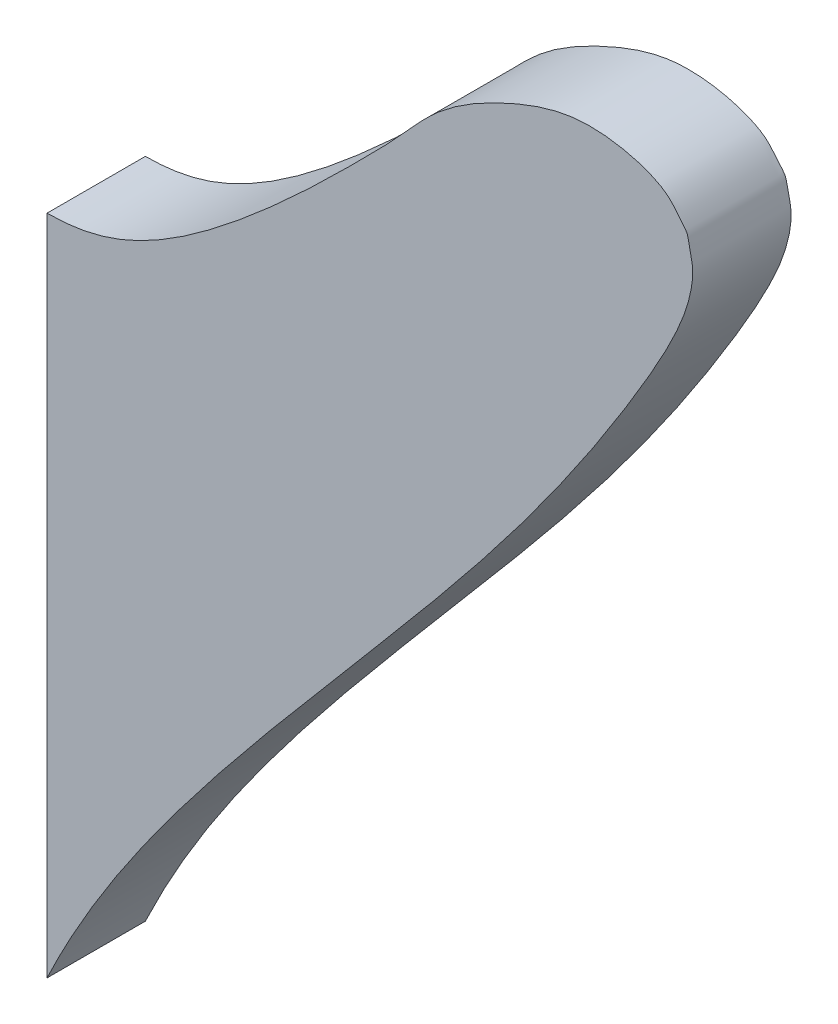
ISO-10303-21;
HEADER;
FILE_DESCRIPTION(('STEP AP214'),'2;1');
FILE_NAME('part.step','',(''),(''),'','','');
FILE_SCHEMA(('AUTOMOTIVE_DESIGN { 1 0 10303 214 1 1 1 1 }'));
ENDSEC;
DATA;
#1=APPLICATION_CONTEXT('core data for automotive mechanical design processes');
#2=APPLICATION_PROTOCOL_DEFINITION('international standard','automotive_design',2000,#1);
#3=PRODUCT_CONTEXT('',#1,'mechanical');
#4=PRODUCT('Part','Part','',(#3));
#5=PRODUCT_RELATED_PRODUCT_CATEGORY('part','',(#4));
#6=PRODUCT_DEFINITION_FORMATION('','',#4);
#7=PRODUCT_DEFINITION_CONTEXT('part definition',#1,'design');
#8=PRODUCT_DEFINITION('design','',#6,#7);
#9=PRODUCT_DEFINITION_SHAPE('','',#8);
#10=(LENGTH_UNIT() NAMED_UNIT(*) SI_UNIT(.MILLI.,.METRE.));
#11=(NAMED_UNIT(*) PLANE_ANGLE_UNIT() SI_UNIT($,.RADIAN.));
#12=(NAMED_UNIT(*) SI_UNIT($,.STERADIAN.) SOLID_ANGLE_UNIT());
#13=UNCERTAINTY_MEASURE_WITH_UNIT(LENGTH_MEASURE(1.E-05),#10,'distance_accuracy_value','');
#14=(GEOMETRIC_REPRESENTATION_CONTEXT(3) GLOBAL_UNCERTAINTY_ASSIGNED_CONTEXT((#13)) GLOBAL_UNIT_ASSIGNED_CONTEXT((#10,
#11,#12)) REPRESENTATION_CONTEXT('',''));
#15=CARTESIAN_POINT('',(0.,0.,0.));
#16=DIRECTION('',(0.,0.,1.));
#17=DIRECTION('',(1.,0.,0.));
#18=AXIS2_PLACEMENT_3D('',#15,#16,#17);
#19=CARTESIAN_POINT('',(46.7146471934434,-82.5755886898797,75.9999999999997));
#20=CARTESIAN_POINT('',(49.4790666264603,-76.7318617015448,75.9999999999997));
#21=CARTESIAN_POINT('',(53.0004205057555,-71.336000527109,75.9999999999997));
#22=CARTESIAN_POINT('',(58.7993627327092,-63.5480568472815,75.9999999999997));
#23=CARTESIAN_POINT('',(60.8168402805629,-61.0012728406068,75.9999999999997));
#24=CARTESIAN_POINT('',(64.9193282826502,-55.9760846665263,75.9999999999997));
#25=CARTESIAN_POINT('',(67.0074148734503,-53.4941592659426,75.9999999999997));
#26=CARTESIAN_POINT('',(71.2021494272019,-48.5457594118037,75.9999999999997));
#27=CARTESIAN_POINT('',(73.309300039765,-46.0797033762651,75.9999999999997));
#28=CARTESIAN_POINT('',(77.4881174638829,-41.118053708222,75.9999999999997));
#29=CARTESIAN_POINT('',(79.5616464264986,-38.6228702360359,75.9999999999997));
#30=CARTESIAN_POINT('',(83.6006757792773,-33.5563314655772,75.9999999999997));
#31=CARTESIAN_POINT('',(85.5650695967795,-30.9834551660994,75.9999999999997));
#32=CARTESIAN_POINT('',(89.3422225071696,-25.728745927931,75.9999999999997));
#33=CARTESIAN_POINT('',(91.1534857823623,-23.0458381742905,75.9999999999997));
#34=CARTESIAN_POINT('',(93.7462928489366,-18.9323136246822,75.9999999999997));
#35=CARTESIAN_POINT('',(94.5927483581567,-17.546993496505,75.9999999999997));
#36=CARTESIAN_POINT('',(95.8193145737145,-15.4425955560781,75.9999999999997));
#37=CARTESIAN_POINT('',(96.2207207476519,-14.7372954446462,75.9999999999997));
#38=CARTESIAN_POINT('',(96.9938132302012,-13.3113983593596,75.9999999999997));
#39=CARTESIAN_POINT('',(97.3671886132562,-12.591670754834,75.9999999999997));
#40=CARTESIAN_POINT('',(97.8868240148971,-11.4912711598424,75.9999999999997));
#41=CARTESIAN_POINT('',(98.0528169261708,-11.1207557209404,75.9999999999997));
#42=CARTESIAN_POINT('',(98.3642916754195,-10.3691677607619,75.9999999999997));
#43=CARTESIAN_POINT('',(98.510159844604,-9.9873628745618,75.9999999999997));
#44=CARTESIAN_POINT('',(98.7699215260932,-9.21735456502127,75.9999999999997));
#45=CARTESIAN_POINT('',(98.8830668733913,-8.82819073139706,75.9999999999997));
#46=CARTESIAN_POINT('',(99.0680092055512,-8.03958575087904,75.9999999999997));
#47=CARTESIAN_POINT('',(99.1417314397337,-7.64062313298186,75.9999999999997));
#48=CARTESIAN_POINT('',(99.2239805534843,-6.82649331147684,75.9999999999997));
#49=CARTESIAN_POINT('',(99.2301842735758,-6.4171028144309,75.9999999999997));
#50=CARTESIAN_POINT('',(99.1196132522573,-5.61137561281588,75.9999999999997));
#51=CARTESIAN_POINT('',(99.0042478216408,-5.21484630563093,75.9999999999997));
#52=CARTESIAN_POINT('',(98.9035156803807,-4.71134195030396,75.9999999999997));
#53=CARTESIAN_POINT('',(98.8845248435389,-4.61032783915384,75.9999999999997));
#54=CARTESIAN_POINT('',(98.8441451548617,-4.40894963416346,75.9999999999997));
#55=CARTESIAN_POINT('',(98.8219944509641,-4.30879205155409,75.9999999999997));
#56=CARTESIAN_POINT('',(98.7536375242632,-4.11499748930354,75.9999999999997));
#57=CARTESIAN_POINT('',(98.7045827211304,-4.02154140783188,75.9999999999997));
#58=CARTESIAN_POINT('',(98.5860205194525,-3.84267985035704,75.9999999999997));
#59=CARTESIAN_POINT('',(98.5198167069507,-3.759381063914,75.9999999999997));
#60=CARTESIAN_POINT('',(98.3864208887569,-3.59365881175838,75.9999999999997));
#61=CARTESIAN_POINT('',(98.3183074213288,-3.51205155745826,75.9999999999997));
#62=CARTESIAN_POINT('',(98.1833807429467,-3.34768530903873,75.9999999999997));
#63=CARTESIAN_POINT('',(98.1167468536361,-3.26476747558165,75.9999999999997));
#64=CARTESIAN_POINT('',(97.9157743901514,-3.01696246337483,75.9999999999997));
#65=CARTESIAN_POINT('',(97.7795334721348,-2.85376034076389,75.9999999999997));
#66=CARTESIAN_POINT('',(97.4931495948736,-2.53967023107715,75.9999999999997));
#67=CARTESIAN_POINT('',(97.3423013781426,-2.38940694623991,75.9999999999997));
#68=CARTESIAN_POINT('',(97.0105195433475,-2.11552939188444,75.9999999999997));
#69=CARTESIAN_POINT('',(96.8331479660211,-1.99320406211955,75.9999999999997));
#70=CARTESIAN_POINT('',(96.2872214020797,-1.66584047050697,75.9999999999997));
#71=CARTESIAN_POINT('',(95.9008922849225,-1.49327493738066,75.9999999999997));
#72=CARTESIAN_POINT('',(95.1092727413724,-1.18684662415242,75.9999999999997));
#73=CARTESIAN_POINT('',(94.6999525556935,-1.05924452072374,75.9999999999997));
#74=CARTESIAN_POINT('',(93.88084403347,-0.848379379664353,75.9999999999997));
#75=CARTESIAN_POINT('',(93.468731910108,-0.762337387819492,75.9999999999997));
#76=CARTESIAN_POINT('',(92.2250818347038,-0.559654968100521,75.9999999999997));
#77=CARTESIAN_POINT('',(91.386521477113,-0.496249817979483,75.9999999999997));
#78=CARTESIAN_POINT('',(90.1112856568316,-0.533011829360851,75.9999999999997));
#79=CARTESIAN_POINT('',(89.6854335869218,-0.568651297992018,75.9999999999997));
#80=CARTESIAN_POINT('',(88.8495672052874,-0.685126559776657,75.9999999999997));
#81=CARTESIAN_POINT('',(88.4368711085988,-0.765331788429149,75.9999999999997));
#82=CARTESIAN_POINT('',(87.2116823032485,-1.0600558567445,75.9999999999997));
#83=CARTESIAN_POINT('',(86.4119046765251,-1.32830473210991,75.9999999999997));
#84=CARTESIAN_POINT('',(84.8322444693121,-1.94666904649933,75.9999999999997));
#85=CARTESIAN_POINT('',(84.0603414803284,-2.28850849760403,75.9999999999997));
#86=CARTESIAN_POINT('',(82.5462128761356,-3.02624979291096,75.9999999999997));
#87=CARTESIAN_POINT('',(81.804306414352,-3.42273302945843,75.9999999999997));
#88=CARTESIAN_POINT('',(80.364549029037,-4.29595417216124,75.9999999999997));
#89=CARTESIAN_POINT('',(79.6656432906791,-4.77535121424277,75.9999999999997));
#90=CARTESIAN_POINT('',(78.6703301936709,-5.57648271425853,75.9999999999997));
#91=CARTESIAN_POINT('',(78.3496914416705,-5.85497372513272,75.9999999999997));
#92=CARTESIAN_POINT('',(77.729484041214,-6.43362185738959,75.9999999999997));
#93=CARTESIAN_POINT('',(77.4302180169776,-6.73409016327956,75.9999999999997));
#94=CARTESIAN_POINT('',(76.5487835600218,-7.65232157192908,75.9999999999997));
#95=CARTESIAN_POINT('',(75.9816532239431,-8.28548829716496,75.9999999999997));
#96=CARTESIAN_POINT('',(74.8366219783896,-9.54088342202087,75.9999999999997));
#97=CARTESIAN_POINT('',(74.2545997682248,-10.1596275899831,75.9999999999997));
#98=CARTESIAN_POINT('',(73.0697572511367,-11.3775280804683,75.9999999999997));
#99=CARTESIAN_POINT('',(72.4687098491289,-11.9781197687422,75.9999999999997));
#100=CARTESIAN_POINT('',(70.6624803913141,-13.7745456449036,75.9999999999997));
#101=CARTESIAN_POINT('',(69.454366822624,-14.9675504033984,75.9999999999997));
#102=CARTESIAN_POINT('',(66.9969811446635,-17.3056268790829,75.9999999999997));
#103=CARTESIAN_POINT('',(65.7477747698826,-18.4507751503473,75.9999999999997));
#104=CARTESIAN_POINT('',(63.1992350972073,-20.6826941157749,75.9999999999997));
#105=CARTESIAN_POINT('',(61.9004239473546,-21.7700729010729,75.9999999999997));
#106=CARTESIAN_POINT('',(59.8870604506403,-23.3252714571611,75.9999999999997));
#107=CARTESIAN_POINT('',(59.2050025961176,-23.8309341597347,75.9999999999997));
#108=CARTESIAN_POINT('',(57.8108187118257,-24.8072423104857,75.9999999999997));
#109=CARTESIAN_POINT('',(57.098800708742,-25.2780135660293,75.9999999999997));
#110=CARTESIAN_POINT('',(55.6311888039748,-26.1688077921176,75.9999999999997));
#111=CARTESIAN_POINT('',(54.8843604213477,-26.5834397455028,75.9999999999997));
#112=CARTESIAN_POINT('',(53.3562905470156,-27.3252151298538,75.9999999999997));
#113=CARTESIAN_POINT('',(52.5746433022801,-27.6521894726801,75.9999999999997));
#114=CARTESIAN_POINT('',(51.3656705058305,-28.0516395184336,75.9999999999997));
#115=CARTESIAN_POINT('',(50.9566287583117,-28.1697028354711,75.9999999999997));
#116=CARTESIAN_POINT('',(50.1252774383652,-28.3727483625968,75.9999999999997));
#117=CARTESIAN_POINT('',(49.7011905593687,-28.4579492654971,75.9999999999997));
#118=CARTESIAN_POINT('',(48.4201216707191,-28.6592367179855,75.9999999999997));
#119=CARTESIAN_POINT('',(47.5670304804091,-28.7186826744561,75.9999999999997));
#120=CARTESIAN_POINT('',(46.7146471934355,-28.7227072942091,75.9999999999997));
#121=B_SPLINE_CURVE_WITH_KNOTS('',3,(#19,#20,#21,#22,#23,#24,#25,#26,#27,#28,#29,#30,#31,#32,
#33,#34,#35,#36,#37,#38,#39,#40,#41,#42,#43,#44,#45,#46,#47,#48,#49,#50,#51,#52,#53,#54,#55,#56,
#57,#58,#59,#60,#61,#62,#63,#64,#65,#66,#67,#68,#69,#70,#71,#72,#73,#74,#75,#76,#77,#78,#79,#80,
#81,#82,#83,#84,#85,#86,#87,#88,#89,#90,#91,#92,#93,#94,#95,#96,#97,#98,#99,#100,#101,#102,#103,
#104,#105,#106,#107,#108,#109,#110,#111,#112,#113,#114,#115,#116,#117,#118,#119,#120),
.UNSPECIFIED.,.F.,.F.,(4,2,2,2,2,2,2,2,2,2,2,2,2,2,2,2,2,2,2,2,2,2,2,2,2,2,2,2,2,2,2,2,2,2,2,2,
2,2,2,2,2,2,2,2,2,2,2,2,2,2,4),(0.,0.125000000000001,0.187500000000002,0.250000000000002,
0.312500000000002,0.375000000000003,0.437500000000003,0.500000000000004,0.531250000000004,
0.546875000000004,0.562500000000004,0.570312500000004,0.578125000000004,0.585937500000004,
0.593750000000004,0.601562500000004,0.609375000000004,0.611328125000004,0.613281250000004,
0.615234375000004,0.617187500000004,0.619140625000004,0.621093750000004,0.625000000000004,
0.628906250000004,0.632812500000004,0.640625000000004,0.648437500000004,0.656250000000004,
0.671875000000004,0.679687500000003,0.687500000000003,0.703125000000003,0.718750000000003,
0.734375000000002,0.750000000000002,0.757812500000002,0.765625000000002,0.781250000000002,
0.796875000000002,0.812500000000002,0.843750000000001,0.875000000000001,0.906250000000001,
0.921875000000001,0.937500000000001,0.953125,0.96875,0.9765625,0.984375,1.),.UNSPECIFIED.);
#122=DIRECTION('',(0.,0.,-1.));
#123=VECTOR('',#122,1.);
#124=SURFACE_OF_LINEAR_EXTRUSION('',#121,#123);
#125=CARTESIAN_POINT('',(46.7146471934434,-82.5755886898797,67.9999999999997));
#126=CARTESIAN_POINT('',(49.4790666264603,-76.7318617015448,67.9999999999997));
#127=CARTESIAN_POINT('',(53.0004205057555,-71.336000527109,67.9999999999997));
#128=CARTESIAN_POINT('',(58.7993627327092,-63.5480568472815,67.9999999999997));
#129=CARTESIAN_POINT('',(60.8168402805629,-61.0012728406068,67.9999999999997));
#130=CARTESIAN_POINT('',(64.9193282826502,-55.9760846665263,67.9999999999997));
#131=CARTESIAN_POINT('',(67.0074148734503,-53.4941592659426,67.9999999999997));
#132=CARTESIAN_POINT('',(71.2021494272019,-48.5457594118037,67.9999999999997));
#133=CARTESIAN_POINT('',(73.309300039765,-46.0797033762651,67.9999999999997));
#134=CARTESIAN_POINT('',(77.4881174638829,-41.118053708222,67.9999999999997));
#135=CARTESIAN_POINT('',(79.5616464264986,-38.6228702360359,67.9999999999997));
#136=CARTESIAN_POINT('',(83.6006757792773,-33.5563314655772,67.9999999999997));
#137=CARTESIAN_POINT('',(85.5650695967795,-30.9834551660994,67.9999999999997));
#138=CARTESIAN_POINT('',(89.3422225071696,-25.728745927931,67.9999999999997));
#139=CARTESIAN_POINT('',(91.1534857823623,-23.0458381742905,67.9999999999997));
#140=CARTESIAN_POINT('',(93.7462928489366,-18.9323136246822,67.9999999999997));
#141=CARTESIAN_POINT('',(94.5927483581567,-17.546993496505,67.9999999999997));
#142=CARTESIAN_POINT('',(95.8193145737145,-15.4425955560781,67.9999999999997));
#143=CARTESIAN_POINT('',(96.2207207476519,-14.7372954446462,67.9999999999997));
#144=CARTESIAN_POINT('',(96.9938132302012,-13.3113983593596,67.9999999999997));
#145=CARTESIAN_POINT('',(97.3671886132562,-12.591670754834,67.9999999999997));
#146=CARTESIAN_POINT('',(97.8868240148971,-11.4912711598424,67.9999999999997));
#147=CARTESIAN_POINT('',(98.0528169261708,-11.1207557209404,67.9999999999997));
#148=CARTESIAN_POINT('',(98.3642916754195,-10.3691677607619,67.9999999999997));
#149=CARTESIAN_POINT('',(98.510159844604,-9.9873628745618,67.9999999999997));
#150=CARTESIAN_POINT('',(98.7699215260932,-9.21735456502127,67.9999999999997));
#151=CARTESIAN_POINT('',(98.8830668733913,-8.82819073139706,67.9999999999997));
#152=CARTESIAN_POINT('',(99.0680092055512,-8.03958575087904,67.9999999999997));
#153=CARTESIAN_POINT('',(99.1417314397337,-7.64062313298186,67.9999999999997));
#154=CARTESIAN_POINT('',(99.2239805534843,-6.82649331147684,67.9999999999997));
#155=CARTESIAN_POINT('',(99.2301842735758,-6.4171028144309,67.9999999999997));
#156=CARTESIAN_POINT('',(99.1196132522573,-5.61137561281588,67.9999999999997));
#157=CARTESIAN_POINT('',(99.0042478216408,-5.21484630563093,67.9999999999997));
#158=CARTESIAN_POINT('',(98.9035156803807,-4.71134195030396,67.9999999999997));
#159=CARTESIAN_POINT('',(98.8845248435389,-4.61032783915384,67.9999999999997));
#160=CARTESIAN_POINT('',(98.8441451548617,-4.40894963416346,67.9999999999997));
#161=CARTESIAN_POINT('',(98.8219944509641,-4.30879205155409,67.9999999999997));
#162=CARTESIAN_POINT('',(98.7536375242632,-4.11499748930354,67.9999999999997));
#163=CARTESIAN_POINT('',(98.7045827211304,-4.02154140783188,67.9999999999997));
#164=CARTESIAN_POINT('',(98.5860205194525,-3.84267985035704,67.9999999999997));
#165=CARTESIAN_POINT('',(98.5198167069507,-3.759381063914,67.9999999999997));
#166=CARTESIAN_POINT('',(98.3864208887569,-3.59365881175838,67.9999999999997));
#167=CARTESIAN_POINT('',(98.3183074213288,-3.51205155745826,67.9999999999997));
#168=CARTESIAN_POINT('',(98.1833807429467,-3.34768530903873,67.9999999999997));
#169=CARTESIAN_POINT('',(98.1167468536361,-3.26476747558165,67.9999999999997));
#170=CARTESIAN_POINT('',(97.9157743901514,-3.01696246337483,67.9999999999997));
#171=CARTESIAN_POINT('',(97.7795334721348,-2.85376034076389,67.9999999999997));
#172=CARTESIAN_POINT('',(97.4931495948736,-2.53967023107715,67.9999999999997));
#173=CARTESIAN_POINT('',(97.3423013781426,-2.38940694623991,67.9999999999997));
#174=CARTESIAN_POINT('',(97.0105195433475,-2.11552939188444,67.9999999999997));
#175=CARTESIAN_POINT('',(96.8331479660211,-1.99320406211955,67.9999999999997));
#176=CARTESIAN_POINT('',(96.2872214020797,-1.66584047050697,67.9999999999997));
#177=CARTESIAN_POINT('',(95.9008922849225,-1.49327493738066,67.9999999999997));
#178=CARTESIAN_POINT('',(95.1092727413724,-1.18684662415242,67.9999999999997));
#179=CARTESIAN_POINT('',(94.6999525556935,-1.05924452072374,67.9999999999997));
#180=CARTESIAN_POINT('',(93.88084403347,-0.848379379664353,67.9999999999997));
#181=CARTESIAN_POINT('',(93.468731910108,-0.762337387819492,67.9999999999997));
#182=CARTESIAN_POINT('',(92.2250818347038,-0.559654968100521,67.9999999999997));
#183=CARTESIAN_POINT('',(91.386521477113,-0.496249817979483,67.9999999999997));
#184=CARTESIAN_POINT('',(90.1112856568316,-0.533011829360851,67.9999999999997));
#185=CARTESIAN_POINT('',(89.6854335869218,-0.568651297992018,67.9999999999997));
#186=CARTESIAN_POINT('',(88.8495672052874,-0.685126559776657,67.9999999999997));
#187=CARTESIAN_POINT('',(88.4368711085988,-0.765331788429149,67.9999999999997));
#188=CARTESIAN_POINT('',(87.2116823032485,-1.0600558567445,67.9999999999997));
#189=CARTESIAN_POINT('',(86.4119046765251,-1.32830473210991,67.9999999999997));
#190=CARTESIAN_POINT('',(84.8322444693121,-1.94666904649933,67.9999999999997));
#191=CARTESIAN_POINT('',(84.0603414803284,-2.28850849760403,67.9999999999997));
#192=CARTESIAN_POINT('',(82.5462128761356,-3.02624979291096,67.9999999999997));
#193=CARTESIAN_POINT('',(81.804306414352,-3.42273302945843,67.9999999999997));
#194=CARTESIAN_POINT('',(80.364549029037,-4.29595417216124,67.9999999999997));
#195=CARTESIAN_POINT('',(79.6656432906791,-4.77535121424277,67.9999999999997));
#196=CARTESIAN_POINT('',(78.6703301936709,-5.57648271425853,67.9999999999997));
#197=CARTESIAN_POINT('',(78.3496914416705,-5.85497372513272,67.9999999999997));
#198=CARTESIAN_POINT('',(77.729484041214,-6.43362185738959,67.9999999999997));
#199=CARTESIAN_POINT('',(77.4302180169776,-6.73409016327956,67.9999999999997));
#200=CARTESIAN_POINT('',(76.5487835600218,-7.65232157192908,67.9999999999997));
#201=CARTESIAN_POINT('',(75.9816532239431,-8.28548829716496,67.9999999999997));
#202=CARTESIAN_POINT('',(74.8366219783896,-9.54088342202087,67.9999999999997));
#203=CARTESIAN_POINT('',(74.2545997682248,-10.1596275899831,67.9999999999997));
#204=CARTESIAN_POINT('',(73.0697572511367,-11.3775280804683,67.9999999999997));
#205=CARTESIAN_POINT('',(72.4687098491289,-11.9781197687422,67.9999999999997));
#206=CARTESIAN_POINT('',(70.6624803913141,-13.7745456449036,67.9999999999997));
#207=CARTESIAN_POINT('',(69.454366822624,-14.9675504033984,67.9999999999997));
#208=CARTESIAN_POINT('',(66.9969811446635,-17.3056268790829,67.9999999999997));
#209=CARTESIAN_POINT('',(65.7477747698826,-18.4507751503473,67.9999999999997));
#210=CARTESIAN_POINT('',(63.1992350972073,-20.6826941157749,67.9999999999997));
#211=CARTESIAN_POINT('',(61.9004239473546,-21.7700729010729,67.9999999999997));
#212=CARTESIAN_POINT('',(59.8870604506403,-23.3252714571611,67.9999999999997));
#213=CARTESIAN_POINT('',(59.2050025961176,-23.8309341597347,67.9999999999997));
#214=CARTESIAN_POINT('',(57.8108187118257,-24.8072423104857,67.9999999999997));
#215=CARTESIAN_POINT('',(57.098800708742,-25.2780135660293,67.9999999999997));
#216=CARTESIAN_POINT('',(55.6311888039748,-26.1688077921176,67.9999999999997));
#217=CARTESIAN_POINT('',(54.8843604213477,-26.5834397455028,67.9999999999997));
#218=CARTESIAN_POINT('',(53.3562905470156,-27.3252151298538,67.9999999999997));
#219=CARTESIAN_POINT('',(52.5746433022801,-27.6521894726801,67.9999999999997));
#220=CARTESIAN_POINT('',(51.3656705058305,-28.0516395184336,67.9999999999997));
#221=CARTESIAN_POINT('',(50.9566287583117,-28.1697028354711,67.9999999999997));
#222=CARTESIAN_POINT('',(50.1252774383652,-28.3727483625968,67.9999999999997));
#223=CARTESIAN_POINT('',(49.7011905593687,-28.4579492654971,67.9999999999997));
#224=CARTESIAN_POINT('',(48.4201216707191,-28.6592367179855,67.9999999999997));
#225=CARTESIAN_POINT('',(47.5670304804091,-28.7186826744561,67.9999999999997));
#226=CARTESIAN_POINT('',(46.7146471934355,-28.7227072942091,67.9999999999997));
#227=B_SPLINE_CURVE_WITH_KNOTS('',3,(#125,#126,#127,#128,#129,#130,#131,#132,#133,#134,#135,
#136,#137,#138,#139,#140,#141,#142,#143,#144,#145,#146,#147,#148,#149,#150,#151,#152,#153,#154,
#155,#156,#157,#158,#159,#160,#161,#162,#163,#164,#165,#166,#167,#168,#169,#170,#171,#172,#173,
#174,#175,#176,#177,#178,#179,#180,#181,#182,#183,#184,#185,#186,#187,#188,#189,#190,#191,#192,
#193,#194,#195,#196,#197,#198,#199,#200,#201,#202,#203,#204,#205,#206,#207,#208,#209,#210,#211,
#212,#213,#214,#215,#216,#217,#218,#219,#220,#221,#222,#223,#224,#225,#226),.UNSPECIFIED.,.F.,
.F.,(4,2,2,2,2,2,2,2,2,2,2,2,2,2,2,2,2,2,2,2,2,2,2,2,2,2,2,2,2,2,2,2,2,2,2,2,2,2,2,2,2,2,2,2,2,
2,2,2,2,2,4),(0.,0.125000000000001,0.187500000000002,0.250000000000002,0.312500000000002,
0.375000000000003,0.437500000000003,0.500000000000004,0.531250000000004,0.546875000000004,
0.562500000000004,0.570312500000004,0.578125000000004,0.585937500000004,0.593750000000004,
0.601562500000004,0.609375000000004,0.611328125000004,0.613281250000004,0.615234375000004,
0.617187500000004,0.619140625000004,0.621093750000004,0.625000000000004,0.628906250000004,
0.632812500000004,0.640625000000004,0.648437500000004,0.656250000000004,0.671875000000004,
0.679687500000003,0.687500000000003,0.703125000000003,0.718750000000003,0.734375000000002,
0.750000000000002,0.757812500000002,0.765625000000002,0.781250000000002,0.796875000000002,
0.812500000000002,0.843750000000001,0.875000000000001,0.906250000000001,0.921875000000001,
0.937500000000001,0.953125,0.96875,0.9765625,0.984375,1.),.UNSPECIFIED.);
#228=CARTESIAN_POINT('',(46.7146471934355,-82.5755886898964,67.9999999999997));
#229=VERTEX_POINT('',#228);
#230=CARTESIAN_POINT('',(46.7146471934546,-28.7227072941992,67.9999999999997));
#231=VERTEX_POINT('',#230);
#232=EDGE_CURVE('E65',#229,#231,#227,.T.);
#233=ORIENTED_EDGE('',*,*,#232,.T.);
#234=DIRECTION('',(0.,0.,-1.));
#235=VECTOR('',#234,1.);
#236=CARTESIAN_POINT('',(46.7146471934546,-28.7227072941992,75.9999999999997));
#237=LINE('',#236,#235);
#238=CARTESIAN_POINT('',(46.7146471934546,-28.7227072941992,75.9999999999997));
#239=VERTEX_POINT('',#238);
#240=EDGE_CURVE('E11',#239,#231,#237,.T.);
#241=ORIENTED_EDGE('',*,*,#240,.F.);
#242=CARTESIAN_POINT('',(46.7146471934355,-28.7227072942091,75.9999999999997));
#243=CARTESIAN_POINT('',(47.5670304804091,-28.7186826744561,75.9999999999997));
#244=CARTESIAN_POINT('',(48.4201216707191,-28.6592367179855,75.9999999999997));
#245=CARTESIAN_POINT('',(49.7011905593687,-28.4579492654971,75.9999999999997));
#246=CARTESIAN_POINT('',(50.1252774383652,-28.3727483625968,75.9999999999997));
#247=CARTESIAN_POINT('',(50.9566287583117,-28.1697028354711,75.9999999999997));
#248=CARTESIAN_POINT('',(51.3656705058305,-28.0516395184336,75.9999999999997));
#249=CARTESIAN_POINT('',(52.5746433022801,-27.6521894726801,75.9999999999997));
#250=CARTESIAN_POINT('',(53.3562905470156,-27.3252151298538,75.9999999999997));
#251=CARTESIAN_POINT('',(54.8843604213477,-26.5834397455028,75.9999999999997));
#252=CARTESIAN_POINT('',(55.6311888039748,-26.1688077921176,75.9999999999997));
#253=CARTESIAN_POINT('',(57.098800708742,-25.2780135660293,75.9999999999997));
#254=CARTESIAN_POINT('',(57.8108187118257,-24.8072423104857,75.9999999999997));
#255=CARTESIAN_POINT('',(59.2050025961176,-23.8309341597347,75.9999999999997));
#256=CARTESIAN_POINT('',(59.8870604506403,-23.3252714571611,75.9999999999997));
#257=CARTESIAN_POINT('',(61.9004239473546,-21.7700729010729,75.9999999999997));
#258=CARTESIAN_POINT('',(63.1992350972073,-20.6826941157749,75.9999999999997));
#259=CARTESIAN_POINT('',(65.7477747698826,-18.4507751503473,75.9999999999997));
#260=CARTESIAN_POINT('',(66.9969811446635,-17.3056268790829,75.9999999999997));
#261=CARTESIAN_POINT('',(69.454366822624,-14.9675504033984,75.9999999999997));
#262=CARTESIAN_POINT('',(70.6624803913141,-13.7745456449036,75.9999999999997));
#263=CARTESIAN_POINT('',(72.4687098491289,-11.9781197687422,75.9999999999997));
#264=CARTESIAN_POINT('',(73.0697572511367,-11.3775280804683,75.9999999999997));
#265=CARTESIAN_POINT('',(74.2545997682248,-10.1596275899831,75.9999999999997));
#266=CARTESIAN_POINT('',(74.8366219783896,-9.54088342202087,75.9999999999997));
#267=CARTESIAN_POINT('',(75.9816532239431,-8.28548829716496,75.9999999999997));
#268=CARTESIAN_POINT('',(76.5487835600218,-7.65232157192908,75.9999999999997));
#269=CARTESIAN_POINT('',(77.4302180169776,-6.73409016327956,75.9999999999997));
#270=CARTESIAN_POINT('',(77.729484041214,-6.43362185738959,75.9999999999997));
#271=CARTESIAN_POINT('',(78.3496914416705,-5.85497372513272,75.9999999999997));
#272=CARTESIAN_POINT('',(78.6703301936709,-5.57648271425853,75.9999999999997));
#273=CARTESIAN_POINT('',(79.6656432906791,-4.77535121424277,75.9999999999997));
#274=CARTESIAN_POINT('',(80.364549029037,-4.29595417216124,75.9999999999997));
#275=CARTESIAN_POINT('',(81.804306414352,-3.42273302945843,75.9999999999997));
#276=CARTESIAN_POINT('',(82.5462128761356,-3.02624979291096,75.9999999999997));
#277=CARTESIAN_POINT('',(84.0603414803284,-2.28850849760403,75.9999999999997));
#278=CARTESIAN_POINT('',(84.8322444693121,-1.94666904649933,75.9999999999997));
#279=CARTESIAN_POINT('',(86.4119046765251,-1.32830473210991,75.9999999999997));
#280=CARTESIAN_POINT('',(87.2116823032485,-1.0600558567445,75.9999999999997));
#281=CARTESIAN_POINT('',(88.4368711085988,-0.765331788429149,75.9999999999997));
#282=CARTESIAN_POINT('',(88.8495672052874,-0.685126559776657,75.9999999999997));
#283=CARTESIAN_POINT('',(89.6854335869218,-0.568651297992018,75.9999999999997));
#284=CARTESIAN_POINT('',(90.1112856568316,-0.533011829360851,75.9999999999997));
#285=CARTESIAN_POINT('',(91.386521477113,-0.496249817979483,75.9999999999997));
#286=CARTESIAN_POINT('',(92.2250818347038,-0.559654968100521,75.9999999999997));
#287=CARTESIAN_POINT('',(93.468731910108,-0.762337387819492,75.9999999999997));
#288=CARTESIAN_POINT('',(93.88084403347,-0.848379379664353,75.9999999999997));
#289=CARTESIAN_POINT('',(94.6999525556935,-1.05924452072374,75.9999999999997));
#290=CARTESIAN_POINT('',(95.1092727413724,-1.18684662415242,75.9999999999997));
#291=CARTESIAN_POINT('',(95.9008922849225,-1.49327493738066,75.9999999999997));
#292=CARTESIAN_POINT('',(96.2872214020797,-1.66584047050697,75.9999999999997));
#293=CARTESIAN_POINT('',(96.8331479660211,-1.99320406211955,75.9999999999997));
#294=CARTESIAN_POINT('',(97.0105195433475,-2.11552939188444,75.9999999999997));
#295=CARTESIAN_POINT('',(97.3423013781426,-2.38940694623991,75.9999999999997));
#296=CARTESIAN_POINT('',(97.4931495948736,-2.53967023107715,75.9999999999997));
#297=CARTESIAN_POINT('',(97.7795334721348,-2.85376034076389,75.9999999999997));
#298=CARTESIAN_POINT('',(97.9157743901514,-3.01696246337483,75.9999999999997));
#299=CARTESIAN_POINT('',(98.1167468536361,-3.26476747558165,75.9999999999997));
#300=CARTESIAN_POINT('',(98.1833807429467,-3.34768530903873,75.9999999999997));
#301=CARTESIAN_POINT('',(98.3183074213288,-3.51205155745826,75.9999999999997));
#302=CARTESIAN_POINT('',(98.3864208887569,-3.59365881175838,75.9999999999997));
#303=CARTESIAN_POINT('',(98.5198167069507,-3.759381063914,75.9999999999997));
#304=CARTESIAN_POINT('',(98.5860205194525,-3.84267985035704,75.9999999999997));
#305=CARTESIAN_POINT('',(98.7045827211304,-4.02154140783188,75.9999999999997));
#306=CARTESIAN_POINT('',(98.7536375242632,-4.11499748930354,75.9999999999997));
#307=CARTESIAN_POINT('',(98.8219944509641,-4.30879205155409,75.9999999999997));
#308=CARTESIAN_POINT('',(98.8441451548617,-4.40894963416346,75.9999999999997));
#309=CARTESIAN_POINT('',(98.8845248435389,-4.61032783915384,75.9999999999997));
#310=CARTESIAN_POINT('',(98.9035156803807,-4.71134195030396,75.9999999999997));
#311=CARTESIAN_POINT('',(99.0042478216408,-5.21484630563093,75.9999999999997));
#312=CARTESIAN_POINT('',(99.1196132522573,-5.61137561281588,75.9999999999997));
#313=CARTESIAN_POINT('',(99.2301842735758,-6.4171028144309,75.9999999999997));
#314=CARTESIAN_POINT('',(99.2239805534843,-6.82649331147684,75.9999999999997));
#315=CARTESIAN_POINT('',(99.1417314397337,-7.64062313298186,75.9999999999997));
#316=CARTESIAN_POINT('',(99.0680092055512,-8.03958575087904,75.9999999999997));
#317=CARTESIAN_POINT('',(98.8830668733913,-8.82819073139706,75.9999999999997));
#318=CARTESIAN_POINT('',(98.7699215260932,-9.21735456502127,75.9999999999997));
#319=CARTESIAN_POINT('',(98.510159844604,-9.9873628745618,75.9999999999997));
#320=CARTESIAN_POINT('',(98.3642916754195,-10.3691677607619,75.9999999999997));
#321=CARTESIAN_POINT('',(98.0528169261708,-11.1207557209404,75.9999999999997));
#322=CARTESIAN_POINT('',(97.8868240148971,-11.4912711598424,75.9999999999997));
#323=CARTESIAN_POINT('',(97.3671886132562,-12.591670754834,75.9999999999997));
#324=CARTESIAN_POINT('',(96.9938132302012,-13.3113983593596,75.9999999999997));
#325=CARTESIAN_POINT('',(96.2207207476519,-14.7372954446462,75.9999999999997));
#326=CARTESIAN_POINT('',(95.8193145737145,-15.4425955560781,75.9999999999997));
#327=CARTESIAN_POINT('',(94.5927483581567,-17.546993496505,75.9999999999997));
#328=CARTESIAN_POINT('',(93.7462928489366,-18.9323136246822,75.9999999999997));
#329=CARTESIAN_POINT('',(91.1534857823623,-23.0458381742905,75.9999999999997));
#330=CARTESIAN_POINT('',(89.3422225071696,-25.728745927931,75.9999999999997));
#331=CARTESIAN_POINT('',(85.5650695967795,-30.9834551660994,75.9999999999997));
#332=CARTESIAN_POINT('',(83.6006757792773,-33.5563314655772,75.9999999999997));
#333=CARTESIAN_POINT('',(79.5616464264986,-38.6228702360359,75.9999999999997));
#334=CARTESIAN_POINT('',(77.4881174638829,-41.118053708222,75.9999999999997));
#335=CARTESIAN_POINT('',(73.309300039765,-46.0797033762651,75.9999999999997));
#336=CARTESIAN_POINT('',(71.2021494272019,-48.5457594118037,75.9999999999997));
#337=CARTESIAN_POINT('',(67.0074148734503,-53.4941592659426,75.9999999999997));
#338=CARTESIAN_POINT('',(64.9193282826502,-55.9760846665263,75.9999999999997));
#339=CARTESIAN_POINT('',(60.8168402805629,-61.0012728406068,75.9999999999997));
#340=CARTESIAN_POINT('',(58.7993627327092,-63.5480568472815,75.9999999999997));
#341=CARTESIAN_POINT('',(53.0004205057555,-71.336000527109,75.9999999999997));
#342=CARTESIAN_POINT('',(49.4790666264603,-76.7318617015448,75.9999999999997));
#343=CARTESIAN_POINT('',(46.7146471934434,-82.5755886898797,75.9999999999997));
#344=B_SPLINE_CURVE_WITH_KNOTS('',3,(#242,#243,#244,#245,#246,#247,#248,#249,#250,#251,#252,
#253,#254,#255,#256,#257,#258,#259,#260,#261,#262,#263,#264,#265,#266,#267,#268,#269,#270,#271,
#272,#273,#274,#275,#276,#277,#278,#279,#280,#281,#282,#283,#284,#285,#286,#287,#288,#289,#290,
#291,#292,#293,#294,#295,#296,#297,#298,#299,#300,#301,#302,#303,#304,#305,#306,#307,#308,#309,
#310,#311,#312,#313,#314,#315,#316,#317,#318,#319,#320,#321,#322,#323,#324,#325,#326,#327,#328,
#329,#330,#331,#332,#333,#334,#335,#336,#337,#338,#339,#340,#341,#342,#343),.UNSPECIFIED.,.F.,
.F.,(4,2,2,2,2,2,2,2,2,2,2,2,2,2,2,2,2,2,2,2,2,2,2,2,2,2,2,2,2,2,2,2,2,2,2,2,2,2,2,2,2,2,2,2,2,
2,2,2,2,2,4),(0.,0.0156249999999999,0.0234374999999999,0.0312499999999999,0.0468749999999997,
0.0624999999999994,0.0781249999999993,0.0937499999999991,0.124999999999999,0.156249999999999,
0.187499999999998,0.203124999999998,0.218749999999998,0.234374999999998,0.242187499999998,
0.249999999999998,0.265624999999998,0.281249999999997,0.296874999999997,0.312499999999997,
0.320312499999997,0.328124999999996,0.343749999999996,0.351562499999996,0.359374999999996,
0.367187499999996,0.371093749999996,0.374999999999996,0.378906249999996,0.380859374999996,
0.382812499999996,0.384765624999996,0.386718749999996,0.388671874999996,0.390624999999996,
0.398437499999996,0.406249999999996,0.414062499999996,0.421874999999996,0.429687499999996,
0.437499999999996,0.453124999999996,0.468749999999996,0.499999999999996,0.562499999999997,
0.624999999999997,0.687499999999998,0.749999999999998,0.812499999999998,0.874999999999999,1.),.UNSPECIFIED.);
#345=CARTESIAN_POINT('',(46.7146471934355,-82.5755886898964,75.9999999999997));
#346=VERTEX_POINT('',#345);
#347=EDGE_CURVE('E64',#346,#239,#344,.F.);
#348=ORIENTED_EDGE('',*,*,#347,.F.);
#349=DIRECTION('',(0.,0.,-1.));
#350=VECTOR('',#349,1.);
#351=CARTESIAN_POINT('',(46.7146471934355,-82.5755886898964,75.9999999999997));
#352=LINE('',#351,#350);
#353=EDGE_CURVE('E41',#346,#229,#352,.T.);
#354=ORIENTED_EDGE('',*,*,#353,.T.);
#355=EDGE_LOOP('',(#233,#241,#348,#354));
#356=FACE_BOUND('',#355,.T.);
#357=ADVANCED_FACE('F30',(#356),#124,.F.);
#358=CARTESIAN_POINT('',(46.7146471934355,-82.5755886898964,75.9999999999997));
#359=DIRECTION('',(1.,-3.5420610462201E-13,0.));
#360=DIRECTION('',(3.5420610462201E-13,1.,0.));
#361=AXIS2_PLACEMENT_3D('',#358,#359,#360);
#362=PLANE('',#361);
#363=DIRECTION('',(-3.5420610462201E-13,-1.,0.));
#364=VECTOR('',#363,1.);
#365=CARTESIAN_POINT('',(46.7146471934355,-82.5755886898964,67.9999999999997));
#366=LINE('',#365,#364);
#367=EDGE_CURVE('E57',#231,#229,#366,.T.);
#368=ORIENTED_EDGE('',*,*,#367,.T.);
#369=ORIENTED_EDGE('',*,*,#353,.F.);
#370=DIRECTION('',(-3.5420610462201E-13,-1.,0.));
#371=VECTOR('',#370,1.);
#372=CARTESIAN_POINT('',(46.7146471934355,-82.5755886898964,75.9999999999997));
#373=LINE('',#372,#371);
#374=EDGE_CURVE('E49',#239,#346,#373,.T.);
#375=ORIENTED_EDGE('',*,*,#374,.F.);
#376=ORIENTED_EDGE('',*,*,#240,.T.);
#377=EDGE_LOOP('',(#368,#369,#375,#376));
#378=FACE_BOUND('',#377,.T.);
#379=ADVANCED_FACE('F60',(#378),#362,.F.);
#380=CARTESIAN_POINT('',(92.8820238267449,-20.3034884745521,75.9999999999997));
#381=DIRECTION('',(0.,0.,-1.));
#382=DIRECTION('',(-1.,0.,0.));
#383=AXIS2_PLACEMENT_3D('',#380,#381,#382);
#384=PLANE('',#383);
#385=ORIENTED_EDGE('',*,*,#347,.T.);
#386=ORIENTED_EDGE('',*,*,#374,.T.);
#387=EDGE_LOOP('',(#385,#386));
#388=FACE_BOUND('',#387,.T.);
#389=ADVANCED_FACE('F87',(#388),#384,.F.);
#390=CARTESIAN_POINT('',(92.8820238267449,-20.3034884745521,67.9999999999997));
#391=DIRECTION('',(0.,0.,-1.));
#392=DIRECTION('',(-1.,0.,0.));
#393=AXIS2_PLACEMENT_3D('',#390,#391,#392);
#394=PLANE('',#393);
#395=ORIENTED_EDGE('',*,*,#232,.F.);
#396=ORIENTED_EDGE('',*,*,#367,.F.);
#397=EDGE_LOOP('',(#395,#396));
#398=FACE_BOUND('',#397,.T.);
#399=ADVANCED_FACE('F71',(#398),#394,.T.);
#400=CLOSED_SHELL('',(#357,#379,#389,#399));
#401=MANIFOLD_SOLID_BREP('B2',#400);
#402=ADVANCED_BREP_SHAPE_REPRESENTATION('',(#18,#401),#14);
#403=SHAPE_DEFINITION_REPRESENTATION(#9,#402);
ENDSEC;
END-ISO-10303-21;
